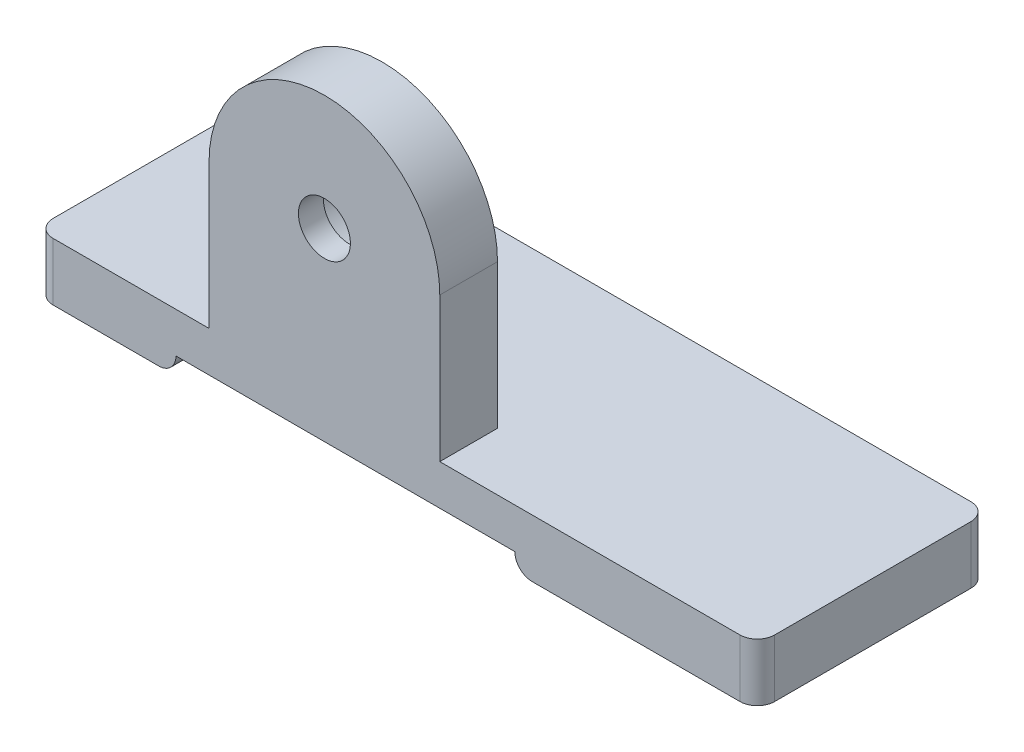
ISO-10303-21;
HEADER;
FILE_DESCRIPTION(('STEP AP214'),'2;1');
FILE_NAME('part.step','',(''),(''),'','','');
FILE_SCHEMA(('AUTOMOTIVE_DESIGN { 1 0 10303 214 1 1 1 1 }'));
ENDSEC;
DATA;
#1=APPLICATION_CONTEXT('core data for automotive mechanical design processes');
#2=APPLICATION_PROTOCOL_DEFINITION('international standard','automotive_design',2000,#1);
#3=PRODUCT_CONTEXT('',#1,'mechanical');
#4=PRODUCT('Part','Part','',(#3));
#5=PRODUCT_RELATED_PRODUCT_CATEGORY('part','',(#4));
#6=PRODUCT_DEFINITION_FORMATION('','',#4);
#7=PRODUCT_DEFINITION_CONTEXT('part definition',#1,'design');
#8=PRODUCT_DEFINITION('design','',#6,#7);
#9=PRODUCT_DEFINITION_SHAPE('','',#8);
#10=(LENGTH_UNIT() NAMED_UNIT(*) SI_UNIT(.MILLI.,.METRE.));
#11=(NAMED_UNIT(*) PLANE_ANGLE_UNIT() SI_UNIT($,.RADIAN.));
#12=(NAMED_UNIT(*) SI_UNIT($,.STERADIAN.) SOLID_ANGLE_UNIT());
#13=UNCERTAINTY_MEASURE_WITH_UNIT(LENGTH_MEASURE(1.E-05),#10,'distance_accuracy_value','');
#14=(GEOMETRIC_REPRESENTATION_CONTEXT(3) GLOBAL_UNCERTAINTY_ASSIGNED_CONTEXT((#13)) GLOBAL_UNIT_ASSIGNED_CONTEXT((#10,
#11,#12)) REPRESENTATION_CONTEXT('',''));
#15=CARTESIAN_POINT('',(0.,0.,0.));
#16=DIRECTION('',(0.,0.,1.));
#17=DIRECTION('',(1.,0.,0.));
#18=AXIS2_PLACEMENT_3D('',#15,#16,#17);
#19=CARTESIAN_POINT('',(0.,0.,0.));
#20=DIRECTION('',(0.,-1.,0.));
#21=DIRECTION('',(0.,0.,-1.));
#22=AXIS2_PLACEMENT_3D('',#19,#20,#21);
#23=PLANE('',#22);
#24=DIRECTION('',(1.,0.,0.));
#25=VECTOR('',#24,1.);
#26=CARTESIAN_POINT('',(0.,0.,-40.));
#27=LINE('',#26,#25);
#28=CARTESIAN_POINT('',(3.,0.,-40.));
#29=VERTEX_POINT('',#28);
#30=CARTESIAN_POINT('',(21.2826238986649,0.,-40.));
#31=VERTEX_POINT('',#30);
#32=EDGE_CURVE('E266',#29,#31,#27,.T.);
#33=ORIENTED_EDGE('',*,*,#32,.T.);
#34=DIRECTION('',(0.,0.,-1.));
#35=VECTOR('',#34,1.);
#36=CARTESIAN_POINT('',(21.2826238986649,0.,0.));
#37=LINE('',#36,#35);
#38=CARTESIAN_POINT('',(21.2826238986649,0.,0.));
#39=VERTEX_POINT('',#38);
#40=EDGE_CURVE('E11',#31,#39,#37,.F.);
#41=ORIENTED_EDGE('',*,*,#40,.T.);
#42=DIRECTION('',(1.,0.,0.));
#43=VECTOR('',#42,1.);
#44=CARTESIAN_POINT('',(0.,0.,0.));
#45=LINE('',#44,#43);
#46=CARTESIAN_POINT('',(3.,0.,0.));
#47=VERTEX_POINT('',#46);
#48=EDGE_CURVE('E250',#47,#39,#45,.T.);
#49=ORIENTED_EDGE('',*,*,#48,.F.);
#50=CARTESIAN_POINT('',(3.,0.,-3.));
#51=DIRECTION('',(0.,-1.,0.));
#52=DIRECTION('',(0.,0.,-1.));
#53=AXIS2_PLACEMENT_3D('',#50,#51,#52);
#54=CIRCLE('',#53,3.);
#55=CARTESIAN_POINT('',(0.,0.,-3.));
#56=VERTEX_POINT('',#55);
#57=EDGE_CURVE('E289',#47,#56,#54,.T.);
#58=ORIENTED_EDGE('',*,*,#57,.T.);
#59=DIRECTION('',(0.,0.,-1.));
#60=VECTOR('',#59,1.);
#61=CARTESIAN_POINT('',(0.,0.,0.));
#62=LINE('',#61,#60);
#63=CARTESIAN_POINT('',(0.,0.,-37.));
#64=VERTEX_POINT('',#63);
#65=EDGE_CURVE('E244',#56,#64,#62,.T.);
#66=ORIENTED_EDGE('',*,*,#65,.T.);
#67=CARTESIAN_POINT('',(3.,0.,-37.));
#68=DIRECTION('',(0.,-1.,0.));
#69=DIRECTION('',(0.,0.,-1.));
#70=AXIS2_PLACEMENT_3D('',#67,#68,#69);
#71=CIRCLE('',#70,3.);
#72=EDGE_CURVE('E286',#64,#29,#71,.T.);
#73=ORIENTED_EDGE('',*,*,#72,.T.);
#74=EDGE_LOOP('',(#33,#41,#49,#58,#66,#73));
#75=FACE_BOUND('',#74,.T.);
#76=ADVANCED_FACE('F39',(#75),#23,.T.);
#77=CARTESIAN_POINT('',(0.,10.,0.));
#78=DIRECTION('',(0.,-1.,0.));
#79=DIRECTION('',(0.,0.,-1.));
#80=AXIS2_PLACEMENT_3D('',#77,#78,#79);
#81=PLANE('',#80);
#82=DIRECTION('',(0.,0.,-1.));
#83=VECTOR('',#82,1.);
#84=CARTESIAN_POINT('',(0.,10.,0.));
#85=LINE('',#84,#83);
#86=CARTESIAN_POINT('',(0.,10.,-3.));
#87=VERTEX_POINT('',#86);
#88=CARTESIAN_POINT('',(0.,10.,-37.));
#89=VERTEX_POINT('',#88);
#90=EDGE_CURVE('E245',#87,#89,#85,.T.);
#91=ORIENTED_EDGE('',*,*,#90,.F.);
#92=CARTESIAN_POINT('',(3.,10.,-3.));
#93=DIRECTION('',(0.,-1.,0.));
#94=DIRECTION('',(0.,0.,-1.));
#95=AXIS2_PLACEMENT_3D('',#92,#93,#94);
#96=CIRCLE('',#95,3.);
#97=CARTESIAN_POINT('',(3.,10.,0.));
#98=VERTEX_POINT('',#97);
#99=EDGE_CURVE('E308',#87,#98,#96,.F.);
#100=ORIENTED_EDGE('',*,*,#99,.T.);
#101=DIRECTION('',(1.,0.,0.));
#102=VECTOR('',#101,1.);
#103=CARTESIAN_POINT('',(0.,10.,0.));
#104=LINE('',#103,#102);
#105=CARTESIAN_POINT('',(30.0129480811498,10.,0.));
#106=VERTEX_POINT('',#105);
#107=EDGE_CURVE('E259',#98,#106,#104,.T.);
#108=ORIENTED_EDGE('',*,*,#107,.T.);
#109=DIRECTION('',(0.,0.,1.));
#110=VECTOR('',#109,1.);
#111=CARTESIAN_POINT('',(30.0129480811498,10.,0.));
#112=LINE('',#111,#110);
#113=CARTESIAN_POINT('',(30.0129480811498,10.,-10.));
#114=VERTEX_POINT('',#113);
#115=EDGE_CURVE('E240',#114,#106,#112,.T.);
#116=ORIENTED_EDGE('',*,*,#115,.F.);
#117=DIRECTION('',(-1.,0.,0.));
#118=VECTOR('',#117,1.);
#119=CARTESIAN_POINT('',(0.,10.,-10.));
#120=LINE('',#119,#118);
#121=CARTESIAN_POINT('',(69.9870519188502,10.,-10.));
#122=VERTEX_POINT('',#121);
#123=EDGE_CURVE('E229',#122,#114,#120,.T.);
#124=ORIENTED_EDGE('',*,*,#123,.F.);
#125=DIRECTION('',(0.,0.,1.));
#126=VECTOR('',#125,1.);
#127=CARTESIAN_POINT('',(69.9870519188502,10.,0.));
#128=LINE('',#127,#126);
#129=CARTESIAN_POINT('',(69.9870519188502,10.,0.));
#130=VERTEX_POINT('',#129);
#131=EDGE_CURVE('E236',#122,#130,#128,.T.);
#132=ORIENTED_EDGE('',*,*,#131,.T.);
#133=CARTESIAN_POINT('',(122.,10.,0.));
#134=VERTEX_POINT('',#133);
#135=EDGE_CURVE('E258',#130,#134,#104,.T.);
#136=ORIENTED_EDGE('',*,*,#135,.T.);
#137=CARTESIAN_POINT('',(122.,10.,-3.));
#138=DIRECTION('',(0.,-1.,0.));
#139=DIRECTION('',(0.,0.,-1.));
#140=AXIS2_PLACEMENT_3D('',#137,#138,#139);
#141=CIRCLE('',#140,3.);
#142=CARTESIAN_POINT('',(125.,10.,-3.));
#143=VERTEX_POINT('',#142);
#144=EDGE_CURVE('E302',#134,#143,#141,.F.);
#145=ORIENTED_EDGE('',*,*,#144,.T.);
#146=DIRECTION('',(0.,0.,-1.));
#147=VECTOR('',#146,1.);
#148=CARTESIAN_POINT('',(125.,10.,0.));
#149=LINE('',#148,#147);
#150=CARTESIAN_POINT('',(125.,10.,-37.));
#151=VERTEX_POINT('',#150);
#152=EDGE_CURVE('E254',#143,#151,#149,.T.);
#153=ORIENTED_EDGE('',*,*,#152,.T.);
#154=CARTESIAN_POINT('',(122.,10.,-37.));
#155=DIRECTION('',(0.,-1.,0.));
#156=DIRECTION('',(0.,0.,-1.));
#157=AXIS2_PLACEMENT_3D('',#154,#155,#156);
#158=CIRCLE('',#157,3.);
#159=CARTESIAN_POINT('',(122.,10.,-40.));
#160=VERTEX_POINT('',#159);
#161=EDGE_CURVE('E299',#151,#160,#158,.F.);
#162=ORIENTED_EDGE('',*,*,#161,.T.);
#163=DIRECTION('',(1.,0.,0.));
#164=VECTOR('',#163,1.);
#165=CARTESIAN_POINT('',(0.,10.,-40.));
#166=LINE('',#165,#164);
#167=CARTESIAN_POINT('',(3.,10.,-40.));
#168=VERTEX_POINT('',#167);
#169=EDGE_CURVE('E249',#168,#160,#166,.T.);
#170=ORIENTED_EDGE('',*,*,#169,.F.);
#171=CARTESIAN_POINT('',(3.,10.,-37.));
#172=DIRECTION('',(0.,-1.,0.));
#173=DIRECTION('',(0.,0.,-1.));
#174=AXIS2_PLACEMENT_3D('',#171,#172,#173);
#175=CIRCLE('',#174,3.);
#176=EDGE_CURVE('E305',#168,#89,#175,.F.);
#177=ORIENTED_EDGE('',*,*,#176,.T.);
#178=EDGE_LOOP('',(#91,#100,#108,#116,#124,#132,#136,#145,#153,#162,#170,#177));
#179=FACE_BOUND('',#178,.T.);
#180=ADVANCED_FACE('F375',(#179),#81,.F.);
#181=CARTESIAN_POINT('',(0.,10.,0.));
#182=DIRECTION('',(-1.,0.,0.));
#183=DIRECTION('',(0.,0.,1.));
#184=AXIS2_PLACEMENT_3D('',#181,#182,#183);
#185=PLANE('',#184);
#186=ORIENTED_EDGE('',*,*,#65,.F.);
#187=DIRECTION('',(0.,-1.,0.));
#188=VECTOR('',#187,1.);
#189=CARTESIAN_POINT('',(0.,10.,-3.));
#190=LINE('',#189,#188);
#191=EDGE_CURVE('E296',#56,#87,#190,.F.);
#192=ORIENTED_EDGE('',*,*,#191,.T.);
#193=ORIENTED_EDGE('',*,*,#90,.T.);
#194=DIRECTION('',(0.,-1.,0.));
#195=VECTOR('',#194,1.);
#196=CARTESIAN_POINT('',(0.,10.,-37.));
#197=LINE('',#196,#195);
#198=EDGE_CURVE('E292',#89,#64,#197,.T.);
#199=ORIENTED_EDGE('',*,*,#198,.T.);
#200=EDGE_LOOP('',(#186,#192,#193,#199));
#201=FACE_BOUND('',#200,.T.);
#202=ADVANCED_FACE('F381',(#201),#185,.T.);
#203=CARTESIAN_POINT('',(0.,10.,0.));
#204=DIRECTION('',(0.,0.,-1.));
#205=DIRECTION('',(-1.,0.,0.));
#206=AXIS2_PLACEMENT_3D('',#203,#204,#205);
#207=PLANE('',#206);
#208=CARTESIAN_POINT('',(50.,35.,0.));
#209=DIRECTION('',(0.,0.,-1.));
#210=DIRECTION('',(-1.,0.,0.));
#211=AXIS2_PLACEMENT_3D('',#208,#209,#210);
#212=CIRCLE('',#211,4.5);
#213=CARTESIAN_POINT('',(45.5,35.,0.));
#214=VERTEX_POINT('',#213);
#215=EDGE_CURVE('E466',#214,#214,#212,.T.);
#216=ORIENTED_EDGE('',*,*,#215,.T.);
#217=EDGE_LOOP('',(#216));
#218=FACE_BOUND('',#217,.T.);
#219=DIRECTION('',(0.,1.,0.));
#220=VECTOR('',#219,1.);
#221=CARTESIAN_POINT('',(82.9876655388601,0.,0.));
#222=LINE('',#221,#220);
#223=CARTESIAN_POINT('',(82.9876655388601,3.,0.));
#224=VERTEX_POINT('',#223);
#225=CARTESIAN_POINT('',(82.9876655388601,3.00025914533932,0.));
#226=VERTEX_POINT('',#225);
#227=EDGE_CURVE('E166',#224,#226,#222,.T.);
#228=ORIENTED_EDGE('',*,*,#227,.F.);
#229=CARTESIAN_POINT('',(85.9876655388601,3.,0.));
#230=DIRECTION('',(0.,0.,-1.));
#231=DIRECTION('',(-1.,0.,0.));
#232=AXIS2_PLACEMENT_3D('',#229,#230,#231);
#233=CIRCLE('',#232,3.);
#234=CARTESIAN_POINT('',(85.9876655388601,0.,0.));
#235=VERTEX_POINT('',#234);
#236=EDGE_CURVE('E337',#224,#235,#233,.F.);
#237=ORIENTED_EDGE('',*,*,#236,.T.);
#238=CARTESIAN_POINT('',(122.,0.,0.));
#239=VERTEX_POINT('',#238);
#240=EDGE_CURVE('E273',#235,#239,#45,.T.);
#241=ORIENTED_EDGE('',*,*,#240,.T.);
#242=DIRECTION('',(0.,-1.,0.));
#243=VECTOR('',#242,1.);
#244=CARTESIAN_POINT('',(122.,10.,0.));
#245=LINE('',#244,#243);
#246=EDGE_CURVE('E279',#239,#134,#245,.F.);
#247=ORIENTED_EDGE('',*,*,#246,.T.);
#248=ORIENTED_EDGE('',*,*,#135,.F.);
#249=DIRECTION('',(0.,1.,0.));
#250=VECTOR('',#249,1.);
#251=CARTESIAN_POINT('',(69.9870519188502,0.,0.));
#252=LINE('',#251,#250);
#253=CARTESIAN_POINT('',(69.9870519188502,35.,0.));
#254=VERTEX_POINT('',#253);
#255=EDGE_CURVE('E204',#130,#254,#252,.T.);
#256=ORIENTED_EDGE('',*,*,#255,.T.);
#257=CARTESIAN_POINT('',(50.,35.,0.));
#258=DIRECTION('',(0.,0.,1.));
#259=DIRECTION('',(1.,0.,0.));
#260=AXIS2_PLACEMENT_3D('',#257,#258,#259);
#261=CIRCLE('',#260,19.9870519188502);
#262=CARTESIAN_POINT('',(30.0129480811498,35.,0.));
#263=VERTEX_POINT('',#262);
#264=EDGE_CURVE('E219',#254,#263,#261,.T.);
#265=ORIENTED_EDGE('',*,*,#264,.T.);
#266=DIRECTION('',(0.,1.,0.));
#267=VECTOR('',#266,1.);
#268=CARTESIAN_POINT('',(30.0129480811498,0.,0.));
#269=LINE('',#268,#267);
#270=EDGE_CURVE('E209',#106,#263,#269,.T.);
#271=ORIENTED_EDGE('',*,*,#270,.F.);
#272=ORIENTED_EDGE('',*,*,#107,.F.);
#273=DIRECTION('',(0.,-1.,0.));
#274=VECTOR('',#273,1.);
#275=CARTESIAN_POINT('',(3.,0.,0.));
#276=LINE('',#275,#274);
#277=EDGE_CURVE('E282',#98,#47,#276,.T.);
#278=ORIENTED_EDGE('',*,*,#277,.T.);
#279=ORIENTED_EDGE('',*,*,#48,.T.);
#280=CARTESIAN_POINT('',(21.2826238986649,3.,0.));
#281=DIRECTION('',(0.,0.,-1.));
#282=DIRECTION('',(-1.,0.,0.));
#283=AXIS2_PLACEMENT_3D('',#280,#281,#282);
#284=CIRCLE('',#283,3.);
#285=CARTESIAN_POINT('',(24.2826238986649,3.,0.));
#286=VERTEX_POINT('',#285);
#287=EDGE_CURVE('E334',#39,#286,#284,.F.);
#288=ORIENTED_EDGE('',*,*,#287,.T.);
#289=DIRECTION('',(0.,-1.,0.));
#290=VECTOR('',#289,1.);
#291=CARTESIAN_POINT('',(24.2826238986649,0.,0.));
#292=LINE('',#291,#290);
#293=CARTESIAN_POINT('',(24.2826238986649,3.00025914533932,0.));
#294=VERTEX_POINT('',#293);
#295=EDGE_CURVE('E178',#294,#286,#292,.T.);
#296=ORIENTED_EDGE('',*,*,#295,.F.);
#297=DIRECTION('',(-1.,0.,0.));
#298=VECTOR('',#297,1.);
#299=CARTESIAN_POINT('',(24.2826238986649,3.00025914533932,0.));
#300=LINE('',#299,#298);
#301=EDGE_CURVE('E177',#226,#294,#300,.T.);
#302=ORIENTED_EDGE('',*,*,#301,.F.);
#303=EDGE_LOOP('',(#228,#237,#241,#247,#248,#256,#265,#271,#272,#278,#279,#288,#296,#302));
#304=FACE_BOUND('',#303,.T.);
#305=ADVANCED_FACE('F190',(#218,#304),#207,.F.);
#306=CARTESIAN_POINT('',(125.,10.,0.));
#307=DIRECTION('',(-1.,0.,0.));
#308=DIRECTION('',(0.,0.,1.));
#309=AXIS2_PLACEMENT_3D('',#306,#307,#308);
#310=PLANE('',#309);
#311=ORIENTED_EDGE('',*,*,#152,.F.);
#312=DIRECTION('',(0.,-1.,0.));
#313=VECTOR('',#312,1.);
#314=CARTESIAN_POINT('',(125.,10.,-3.));
#315=LINE('',#314,#313);
#316=CARTESIAN_POINT('',(125.,0.,-3.));
#317=VERTEX_POINT('',#316);
#318=EDGE_CURVE('E321',#143,#317,#315,.T.);
#319=ORIENTED_EDGE('',*,*,#318,.T.);
#320=DIRECTION('',(0.,0.,-1.));
#321=VECTOR('',#320,1.);
#322=CARTESIAN_POINT('',(125.,0.,0.));
#323=LINE('',#322,#321);
#324=CARTESIAN_POINT('',(125.,0.,-37.));
#325=VERTEX_POINT('',#324);
#326=EDGE_CURVE('E269',#317,#325,#323,.T.);
#327=ORIENTED_EDGE('',*,*,#326,.T.);
#328=DIRECTION('',(0.,-1.,0.));
#329=VECTOR('',#328,1.);
#330=CARTESIAN_POINT('',(125.,10.,-37.));
#331=LINE('',#330,#329);
#332=EDGE_CURVE('E318',#325,#151,#331,.F.);
#333=ORIENTED_EDGE('',*,*,#332,.T.);
#334=EDGE_LOOP('',(#311,#319,#327,#333));
#335=FACE_BOUND('',#334,.T.);
#336=ADVANCED_FACE('F413',(#335),#310,.F.);
#337=CARTESIAN_POINT('',(0.,10.,-40.));
#338=DIRECTION('',(0.,0.,-1.));
#339=DIRECTION('',(-1.,0.,0.));
#340=AXIS2_PLACEMENT_3D('',#337,#338,#339);
#341=PLANE('',#340);
#342=CARTESIAN_POINT('',(85.9876655388601,0.,-40.));
#343=VERTEX_POINT('',#342);
#344=CARTESIAN_POINT('',(122.,0.,-40.));
#345=VERTEX_POINT('',#344);
#346=EDGE_CURVE('E265',#343,#345,#27,.T.);
#347=ORIENTED_EDGE('',*,*,#346,.F.);
#348=CARTESIAN_POINT('',(85.9876655388601,3.,-40.));
#349=DIRECTION('',(0.,0.,-1.));
#350=DIRECTION('',(-1.,0.,0.));
#351=AXIS2_PLACEMENT_3D('',#348,#349,#350);
#352=CIRCLE('',#351,3.);
#353=CARTESIAN_POINT('',(82.9876655388601,3.,-40.));
#354=VERTEX_POINT('',#353);
#355=EDGE_CURVE('E345',#343,#354,#352,.T.);
#356=ORIENTED_EDGE('',*,*,#355,.T.);
#357=DIRECTION('',(0.,-1.,0.));
#358=VECTOR('',#357,1.);
#359=CARTESIAN_POINT('',(82.9876655388601,10.,-40.));
#360=LINE('',#359,#358);
#361=CARTESIAN_POINT('',(82.9876655388601,3.00025914533932,-40.));
#362=VERTEX_POINT('',#361);
#363=EDGE_CURVE('E197',#362,#354,#360,.T.);
#364=ORIENTED_EDGE('',*,*,#363,.F.);
#365=DIRECTION('',(1.,0.,0.));
#366=VECTOR('',#365,1.);
#367=CARTESIAN_POINT('',(0.,3.00025914533932,-40.));
#368=LINE('',#367,#366);
#369=CARTESIAN_POINT('',(24.2826238986649,3.00025914533932,-40.));
#370=VERTEX_POINT('',#369);
#371=EDGE_CURVE('E186',#370,#362,#368,.T.);
#372=ORIENTED_EDGE('',*,*,#371,.F.);
#373=DIRECTION('',(0.,1.,0.));
#374=VECTOR('',#373,1.);
#375=CARTESIAN_POINT('',(24.2826238986649,10.,-40.));
#376=LINE('',#375,#374);
#377=CARTESIAN_POINT('',(24.2826238986649,3.,-40.));
#378=VERTEX_POINT('',#377);
#379=EDGE_CURVE('E201',#378,#370,#376,.T.);
#380=ORIENTED_EDGE('',*,*,#379,.F.);
#381=CARTESIAN_POINT('',(21.2826238986649,3.,-40.));
#382=DIRECTION('',(0.,0.,-1.));
#383=DIRECTION('',(-1.,0.,0.));
#384=AXIS2_PLACEMENT_3D('',#381,#382,#383);
#385=CIRCLE('',#384,3.);
#386=EDGE_CURVE('E55',#378,#31,#385,.T.);
#387=ORIENTED_EDGE('',*,*,#386,.T.);
#388=ORIENTED_EDGE('',*,*,#32,.F.);
#389=DIRECTION('',(0.,-1.,0.));
#390=VECTOR('',#389,1.);
#391=CARTESIAN_POINT('',(3.,10.,-40.));
#392=LINE('',#391,#390);
#393=EDGE_CURVE('E315',#29,#168,#392,.F.);
#394=ORIENTED_EDGE('',*,*,#393,.T.);
#395=ORIENTED_EDGE('',*,*,#169,.T.);
#396=DIRECTION('',(0.,-1.,0.));
#397=VECTOR('',#396,1.);
#398=CARTESIAN_POINT('',(122.,0.,-40.));
#399=LINE('',#398,#397);
#400=EDGE_CURVE('E311',#160,#345,#399,.T.);
#401=ORIENTED_EDGE('',*,*,#400,.T.);
#402=EDGE_LOOP('',(#347,#356,#364,#372,#380,#387,#388,#394,#395,#401));
#403=FACE_BOUND('',#402,.T.);
#404=ADVANCED_FACE('F352',(#403),#341,.T.);
#405=ORIENTED_EDGE('',*,*,#240,.F.);
#406=DIRECTION('',(0.,0.,1.));
#407=VECTOR('',#406,1.);
#408=CARTESIAN_POINT('',(85.9876655388601,0.,-40.));
#409=LINE('',#408,#407);
#410=EDGE_CURVE('E340',#235,#343,#409,.F.);
#411=ORIENTED_EDGE('',*,*,#410,.T.);
#412=ORIENTED_EDGE('',*,*,#346,.T.);
#413=CARTESIAN_POINT('',(122.,0.,-37.));
#414=DIRECTION('',(0.,-1.,0.));
#415=DIRECTION('',(0.,0.,-1.));
#416=AXIS2_PLACEMENT_3D('',#413,#414,#415);
#417=CIRCLE('',#416,3.);
#418=EDGE_CURVE('E325',#345,#325,#417,.T.);
#419=ORIENTED_EDGE('',*,*,#418,.T.);
#420=ORIENTED_EDGE('',*,*,#326,.F.);
#421=CARTESIAN_POINT('',(122.,0.,-3.));
#422=DIRECTION('',(0.,-1.,0.));
#423=DIRECTION('',(0.,0.,-1.));
#424=AXIS2_PLACEMENT_3D('',#421,#422,#423);
#425=CIRCLE('',#424,3.);
#426=EDGE_CURVE('E328',#317,#239,#425,.T.);
#427=ORIENTED_EDGE('',*,*,#426,.T.);
#428=EDGE_LOOP('',(#405,#411,#412,#419,#420,#427));
#429=FACE_BOUND('',#428,.T.);
#430=ADVANCED_FACE('F359',(#429),#23,.T.);
#431=CARTESIAN_POINT('',(30.0129480811498,0.,-10.));
#432=DIRECTION('',(1.,0.,0.));
#433=DIRECTION('',(0.,1.,0.));
#434=AXIS2_PLACEMENT_3D('',#431,#432,#433);
#435=PLANE('',#434);
#436=DIRECTION('',(0.,1.,0.));
#437=VECTOR('',#436,1.);
#438=CARTESIAN_POINT('',(30.0129480811498,0.,-10.));
#439=LINE('',#438,#437);
#440=CARTESIAN_POINT('',(30.0129480811498,35.,-10.));
#441=VERTEX_POINT('',#440);
#442=EDGE_CURVE('E213',#114,#441,#439,.T.);
#443=ORIENTED_EDGE('',*,*,#442,.F.);
#444=ORIENTED_EDGE('',*,*,#115,.T.);
#445=ORIENTED_EDGE('',*,*,#270,.T.);
#446=DIRECTION('',(0.,0.,1.));
#447=VECTOR('',#446,1.);
#448=CARTESIAN_POINT('',(30.0129480811498,35.,-10.));
#449=LINE('',#448,#447);
#450=EDGE_CURVE('E225',#441,#263,#449,.T.);
#451=ORIENTED_EDGE('',*,*,#450,.F.);
#452=EDGE_LOOP('',(#443,#444,#445,#451));
#453=FACE_BOUND('',#452,.T.);
#454=ADVANCED_FACE('F393',(#453),#435,.F.);
#455=CARTESIAN_POINT('',(69.9870519188502,0.,-10.));
#456=DIRECTION('',(1.,0.,0.));
#457=DIRECTION('',(0.,0.,-1.));
#458=AXIS2_PLACEMENT_3D('',#455,#456,#457);
#459=PLANE('',#458);
#460=ORIENTED_EDGE('',*,*,#131,.F.);
#461=DIRECTION('',(0.,1.,0.));
#462=VECTOR('',#461,1.);
#463=CARTESIAN_POINT('',(69.9870519188502,0.,-10.));
#464=LINE('',#463,#462);
#465=CARTESIAN_POINT('',(69.9870519188502,35.,-10.));
#466=VERTEX_POINT('',#465);
#467=EDGE_CURVE('E205',#122,#466,#464,.T.);
#468=ORIENTED_EDGE('',*,*,#467,.T.);
#469=DIRECTION('',(0.,0.,1.));
#470=VECTOR('',#469,1.);
#471=CARTESIAN_POINT('',(69.9870519188502,35.,-10.));
#472=LINE('',#471,#470);
#473=EDGE_CURVE('E216',#466,#254,#472,.T.);
#474=ORIENTED_EDGE('',*,*,#473,.T.);
#475=ORIENTED_EDGE('',*,*,#255,.F.);
#476=EDGE_LOOP('',(#460,#468,#474,#475));
#477=FACE_BOUND('',#476,.T.);
#478=ADVANCED_FACE('F403',(#477),#459,.T.);
#479=CARTESIAN_POINT('',(50.,35.,-10.));
#480=DIRECTION('',(0.,0.,1.));
#481=DIRECTION('',(1.,0.,0.));
#482=AXIS2_PLACEMENT_3D('',#479,#480,#481);
#483=PLANE('',#482);
#484=CARTESIAN_POINT('',(50.,35.,-10.));
#485=DIRECTION('',(0.,0.,-1.));
#486=DIRECTION('',(-1.,0.,0.));
#487=AXIS2_PLACEMENT_3D('',#484,#485,#486);
#488=CIRCLE('',#487,9.005);
#489=CARTESIAN_POINT('',(40.995,35.,-10.));
#490=VERTEX_POINT('',#489);
#491=EDGE_CURVE('E453',#490,#490,#488,.T.);
#492=ORIENTED_EDGE('',*,*,#491,.F.);
#493=EDGE_LOOP('',(#492));
#494=FACE_BOUND('',#493,.T.);
#495=ORIENTED_EDGE('',*,*,#467,.F.);
#496=ORIENTED_EDGE('',*,*,#123,.T.);
#497=ORIENTED_EDGE('',*,*,#442,.T.);
#498=CARTESIAN_POINT('',(50.,35.,-10.));
#499=DIRECTION('',(0.,0.,1.));
#500=DIRECTION('',(1.,0.,0.));
#501=AXIS2_PLACEMENT_3D('',#498,#499,#500);
#502=CIRCLE('',#501,19.9870519188502);
#503=EDGE_CURVE('E208',#466,#441,#502,.T.);
#504=ORIENTED_EDGE('',*,*,#503,.F.);
#505=EDGE_LOOP('',(#495,#496,#497,#504));
#506=FACE_BOUND('',#505,.T.);
#507=ADVANCED_FACE('F398',(#494,#506),#483,.F.);
#508=CARTESIAN_POINT('',(50.,35.,-10.));
#509=DIRECTION('',(0.,0.,1.));
#510=DIRECTION('',(1.,0.,0.));
#511=AXIS2_PLACEMENT_3D('',#508,#509,#510);
#512=CYLINDRICAL_SURFACE('',#511,19.9870519188502);
#513=ORIENTED_EDGE('',*,*,#264,.F.);
#514=ORIENTED_EDGE('',*,*,#473,.F.);
#515=ORIENTED_EDGE('',*,*,#503,.T.);
#516=ORIENTED_EDGE('',*,*,#450,.T.);
#517=EDGE_LOOP('',(#513,#514,#515,#516));
#518=FACE_BOUND('',#517,.T.);
#519=ADVANCED_FACE('F441',(#518),#512,.T.);
#520=CARTESIAN_POINT('',(24.2826238986649,0.,-67.));
#521=DIRECTION('',(-1.,0.,0.));
#522=DIRECTION('',(0.,0.,1.));
#523=AXIS2_PLACEMENT_3D('',#520,#521,#522);
#524=PLANE('',#523);
#525=ORIENTED_EDGE('',*,*,#295,.T.);
#526=DIRECTION('',(0.,0.,-1.));
#527=VECTOR('',#526,1.);
#528=CARTESIAN_POINT('',(24.2826238986649,3.,-40.));
#529=LINE('',#528,#527);
#530=EDGE_CURVE('E48',#286,#378,#529,.T.);
#531=ORIENTED_EDGE('',*,*,#530,.T.);
#532=ORIENTED_EDGE('',*,*,#379,.T.);
#533=DIRECTION('',(0.,0.,1.));
#534=VECTOR('',#533,1.);
#535=CARTESIAN_POINT('',(24.2826238986649,3.00025914533932,-67.));
#536=LINE('',#535,#534);
#537=EDGE_CURVE('E188',#370,#294,#536,.T.);
#538=ORIENTED_EDGE('',*,*,#537,.T.);
#539=EDGE_LOOP('',(#525,#531,#532,#538));
#540=FACE_BOUND('',#539,.T.);
#541=ADVANCED_FACE('F349',(#540),#524,.F.);
#542=CARTESIAN_POINT('',(24.2826238986649,3.00025914533932,-67.));
#543=DIRECTION('',(0.,1.,0.));
#544=DIRECTION('',(0.,0.,1.));
#545=AXIS2_PLACEMENT_3D('',#542,#543,#544);
#546=PLANE('',#545);
#547=ORIENTED_EDGE('',*,*,#371,.T.);
#548=DIRECTION('',(0.,0.,1.));
#549=VECTOR('',#548,1.);
#550=CARTESIAN_POINT('',(82.9876655388601,3.00025914533932,-67.));
#551=LINE('',#550,#549);
#552=EDGE_CURVE('E170',#362,#226,#551,.T.);
#553=ORIENTED_EDGE('',*,*,#552,.T.);
#554=ORIENTED_EDGE('',*,*,#301,.T.);
#555=ORIENTED_EDGE('',*,*,#537,.F.);
#556=EDGE_LOOP('',(#547,#553,#554,#555));
#557=FACE_BOUND('',#556,.T.);
#558=ADVANCED_FACE('F182',(#557),#546,.F.);
#559=CARTESIAN_POINT('',(82.9876655388601,0.,-67.));
#560=DIRECTION('',(1.,0.,0.));
#561=DIRECTION('',(0.,0.,-1.));
#562=AXIS2_PLACEMENT_3D('',#559,#560,#561);
#563=PLANE('',#562);
#564=ORIENTED_EDGE('',*,*,#363,.T.);
#565=DIRECTION('',(0.,0.,1.));
#566=VECTOR('',#565,1.);
#567=CARTESIAN_POINT('',(82.9876655388601,3.,0.));
#568=LINE('',#567,#566);
#569=EDGE_CURVE('E173',#354,#224,#568,.T.);
#570=ORIENTED_EDGE('',*,*,#569,.T.);
#571=ORIENTED_EDGE('',*,*,#227,.T.);
#572=ORIENTED_EDGE('',*,*,#552,.F.);
#573=EDGE_LOOP('',(#564,#570,#571,#572));
#574=FACE_BOUND('',#573,.T.);
#575=ADVANCED_FACE('F169',(#574),#563,.F.);
#576=CARTESIAN_POINT('',(3.,10.,-3.));
#577=DIRECTION('',(0.,1.,0.));
#578=DIRECTION('',(0.,0.,1.));
#579=AXIS2_PLACEMENT_3D('',#576,#577,#578);
#580=CYLINDRICAL_SURFACE('',#579,3.);
#581=ORIENTED_EDGE('',*,*,#99,.F.);
#582=ORIENTED_EDGE('',*,*,#191,.F.);
#583=ORIENTED_EDGE('',*,*,#57,.F.);
#584=ORIENTED_EDGE('',*,*,#277,.F.);
#585=EDGE_LOOP('',(#581,#582,#583,#584));
#586=FACE_BOUND('',#585,.T.);
#587=ADVANCED_FACE('F388',(#586),#580,.T.);
#588=CARTESIAN_POINT('',(3.,10.,-37.));
#589=DIRECTION('',(0.,-1.,0.));
#590=DIRECTION('',(0.,0.,-1.));
#591=AXIS2_PLACEMENT_3D('',#588,#589,#590);
#592=CYLINDRICAL_SURFACE('',#591,3.);
#593=ORIENTED_EDGE('',*,*,#176,.F.);
#594=ORIENTED_EDGE('',*,*,#393,.F.);
#595=ORIENTED_EDGE('',*,*,#72,.F.);
#596=ORIENTED_EDGE('',*,*,#198,.F.);
#597=EDGE_LOOP('',(#593,#594,#595,#596));
#598=FACE_BOUND('',#597,.T.);
#599=ADVANCED_FACE('F378',(#598),#592,.T.);
#600=CARTESIAN_POINT('',(122.,10.,-3.));
#601=DIRECTION('',(0.,-1.,0.));
#602=DIRECTION('',(0.,0.,-1.));
#603=AXIS2_PLACEMENT_3D('',#600,#601,#602);
#604=CYLINDRICAL_SURFACE('',#603,3.);
#605=ORIENTED_EDGE('',*,*,#144,.F.);
#606=ORIENTED_EDGE('',*,*,#246,.F.);
#607=ORIENTED_EDGE('',*,*,#426,.F.);
#608=ORIENTED_EDGE('',*,*,#318,.F.);
#609=EDGE_LOOP('',(#605,#606,#607,#608));
#610=FACE_BOUND('',#609,.T.);
#611=ADVANCED_FACE('F411',(#610),#604,.T.);
#612=CARTESIAN_POINT('',(122.,10.,-37.));
#613=DIRECTION('',(0.,1.,0.));
#614=DIRECTION('',(0.,0.,1.));
#615=AXIS2_PLACEMENT_3D('',#612,#613,#614);
#616=CYLINDRICAL_SURFACE('',#615,3.);
#617=ORIENTED_EDGE('',*,*,#161,.F.);
#618=ORIENTED_EDGE('',*,*,#332,.F.);
#619=ORIENTED_EDGE('',*,*,#418,.F.);
#620=ORIENTED_EDGE('',*,*,#400,.F.);
#621=EDGE_LOOP('',(#617,#618,#619,#620));
#622=FACE_BOUND('',#621,.T.);
#623=ADVANCED_FACE('F369',(#622),#616,.T.);
#624=CARTESIAN_POINT('',(85.9876655388601,3.,-67.));
#625=DIRECTION('',(0.,0.,-1.));
#626=DIRECTION('',(-1.,0.,0.));
#627=AXIS2_PLACEMENT_3D('',#624,#625,#626);
#628=CYLINDRICAL_SURFACE('',#627,3.);
#629=ORIENTED_EDGE('',*,*,#355,.F.);
#630=ORIENTED_EDGE('',*,*,#410,.F.);
#631=ORIENTED_EDGE('',*,*,#236,.F.);
#632=ORIENTED_EDGE('',*,*,#569,.F.);
#633=EDGE_LOOP('',(#629,#630,#631,#632));
#634=FACE_BOUND('',#633,.T.);
#635=ADVANCED_FACE('F355',(#634),#628,.T.);
#636=CARTESIAN_POINT('',(21.2826238986649,3.,-67.));
#637=DIRECTION('',(0.,0.,1.));
#638=DIRECTION('',(1.,0.,0.));
#639=AXIS2_PLACEMENT_3D('',#636,#637,#638);
#640=CYLINDRICAL_SURFACE('',#639,3.);
#641=ORIENTED_EDGE('',*,*,#287,.F.);
#642=ORIENTED_EDGE('',*,*,#40,.F.);
#643=ORIENTED_EDGE('',*,*,#386,.F.);
#644=ORIENTED_EDGE('',*,*,#530,.F.);
#645=EDGE_LOOP('',(#641,#642,#643,#644));
#646=FACE_BOUND('',#645,.T.);
#647=ADVANCED_FACE('F41',(#646),#640,.T.);
#648=CARTESIAN_POINT('',(50.,35.,-10.));
#649=DIRECTION('',(0.,0.,-1.));
#650=DIRECTION('',(-1.,0.,0.));
#651=AXIS2_PLACEMENT_3D('',#648,#649,#650);
#652=CYLINDRICAL_SURFACE('',#651,4.5);
#653=ORIENTED_EDGE('',*,*,#215,.F.);
#654=EDGE_LOOP('',(#653));
#655=FACE_BOUND('',#654,.T.);
#656=CARTESIAN_POINT('',(50.,35.,-4.32));
#657=DIRECTION('',(0.,0.,-1.));
#658=DIRECTION('',(-1.,0.,0.));
#659=AXIS2_PLACEMENT_3D('',#656,#657,#658);
#660=CIRCLE('',#659,4.5);
#661=CARTESIAN_POINT('',(45.5,35.,-4.32));
#662=VERTEX_POINT('',#661);
#663=EDGE_CURVE('E460',#662,#662,#660,.T.);
#664=ORIENTED_EDGE('',*,*,#663,.T.);
#665=EDGE_LOOP('',(#664));
#666=FACE_BOUND('',#665,.T.);
#667=ADVANCED_FACE('F472',(#655,#666),#652,.F.);
#668=CARTESIAN_POINT('',(54.5,35.,-4.32));
#669=DIRECTION('',(0.,0.,1.));
#670=DIRECTION('',(1.,0.,0.));
#671=AXIS2_PLACEMENT_3D('',#668,#669,#670);
#672=PLANE('',#671);
#673=ORIENTED_EDGE('',*,*,#663,.F.);
#674=EDGE_LOOP('',(#673));
#675=FACE_BOUND('',#674,.T.);
#676=CARTESIAN_POINT('',(50.,35.,-4.32));
#677=DIRECTION('',(0.,0.,-1.));
#678=DIRECTION('',(-1.,0.,0.));
#679=AXIS2_PLACEMENT_3D('',#676,#677,#678);
#680=CIRCLE('',#679,9.005);
#681=CARTESIAN_POINT('',(40.995,35.,-4.32));
#682=VERTEX_POINT('',#681);
#683=EDGE_CURVE('E456',#682,#682,#680,.T.);
#684=ORIENTED_EDGE('',*,*,#683,.T.);
#685=EDGE_LOOP('',(#684));
#686=FACE_BOUND('',#685,.T.);
#687=ADVANCED_FACE('F475',(#675,#686),#672,.F.);
#688=CARTESIAN_POINT('',(50.,35.,-10.));
#689=DIRECTION('',(0.,0.,-1.));
#690=DIRECTION('',(-1.,0.,0.));
#691=AXIS2_PLACEMENT_3D('',#688,#689,#690);
#692=CYLINDRICAL_SURFACE('',#691,9.005);
#693=ORIENTED_EDGE('',*,*,#683,.F.);
#694=EDGE_LOOP('',(#693));
#695=FACE_BOUND('',#694,.T.);
#696=ORIENTED_EDGE('',*,*,#491,.T.);
#697=EDGE_LOOP('',(#696));
#698=FACE_BOUND('',#697,.T.);
#699=ADVANCED_FACE('F481',(#695,#698),#692,.F.);
#700=CLOSED_SHELL('',(#76,#180,#202,#305,#336,#404,#430,#454,#478,#507,#519,#541,#558,#575,#587,
#599,#611,#623,#635,#647,#667,#687,#699));
#701=MANIFOLD_SOLID_BREP('B2',#700);
#702=ADVANCED_BREP_SHAPE_REPRESENTATION('',(#18,#701),#14);
#703=SHAPE_DEFINITION_REPRESENTATION(#9,#702);
ENDSEC;
END-ISO-10303-21;
